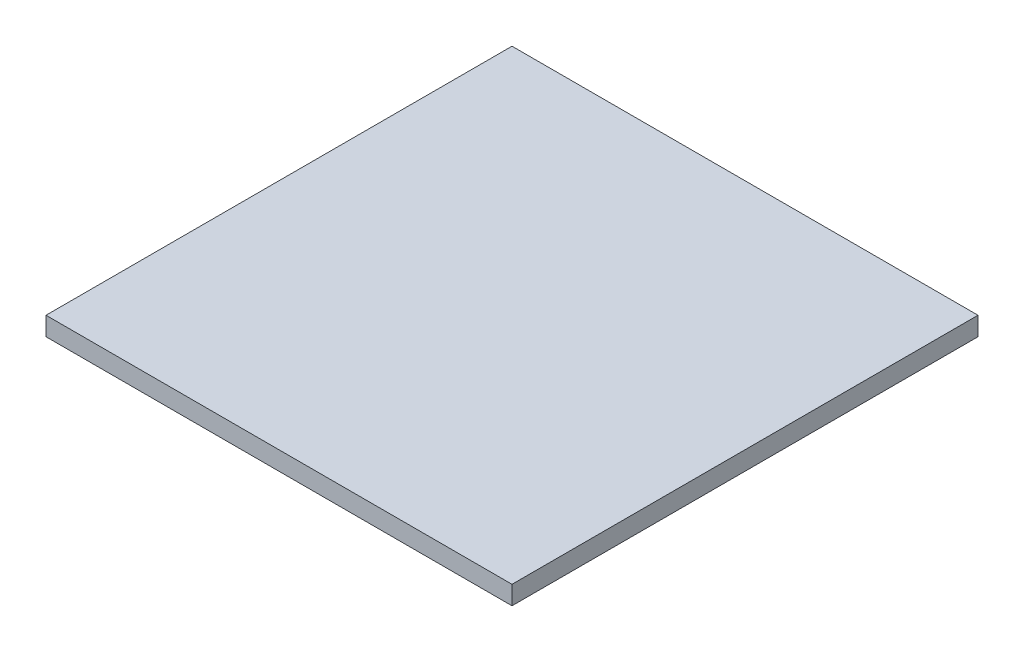
ISO-10303-21;
HEADER;
FILE_DESCRIPTION(('STEP AP214'),'2;1');
FILE_NAME('part.step','',(''),(''),'','','');
FILE_SCHEMA(('AUTOMOTIVE_DESIGN { 1 0 10303 214 1 1 1 1 }'));
ENDSEC;
DATA;
#1=APPLICATION_CONTEXT('core data for automotive mechanical design processes');
#2=APPLICATION_PROTOCOL_DEFINITION('international standard','automotive_design',2000,#1);
#3=PRODUCT_CONTEXT('',#1,'mechanical');
#4=PRODUCT('Part','Part','',(#3));
#5=PRODUCT_RELATED_PRODUCT_CATEGORY('part','',(#4));
#6=PRODUCT_DEFINITION_FORMATION('','',#4);
#7=PRODUCT_DEFINITION_CONTEXT('part definition',#1,'design');
#8=PRODUCT_DEFINITION('design','',#6,#7);
#9=PRODUCT_DEFINITION_SHAPE('','',#8);
#10=(LENGTH_UNIT() NAMED_UNIT(*) SI_UNIT(.MILLI.,.METRE.));
#11=(NAMED_UNIT(*) PLANE_ANGLE_UNIT() SI_UNIT($,.RADIAN.));
#12=(NAMED_UNIT(*) SI_UNIT($,.STERADIAN.) SOLID_ANGLE_UNIT());
#13=UNCERTAINTY_MEASURE_WITH_UNIT(LENGTH_MEASURE(1.E-05),#10,'distance_accuracy_value','');
#14=(GEOMETRIC_REPRESENTATION_CONTEXT(3) GLOBAL_UNCERTAINTY_ASSIGNED_CONTEXT((#13)) GLOBAL_UNIT_ASSIGNED_CONTEXT((#10,
#11,#12)) REPRESENTATION_CONTEXT('',''));
#15=CARTESIAN_POINT('',(0.,0.,0.));
#16=DIRECTION('',(0.,0.,1.));
#17=DIRECTION('',(1.,0.,0.));
#18=AXIS2_PLACEMENT_3D('',#15,#16,#17);
#19=CARTESIAN_POINT('',(-250.,20.,-250.));
#20=DIRECTION('',(1.,0.,0.));
#21=DIRECTION('',(0.,0.,-1.));
#22=AXIS2_PLACEMENT_3D('',#19,#20,#21);
#23=PLANE('',#22);
#24=DIRECTION('',(0.,0.,1.));
#25=VECTOR('',#24,1.);
#26=CARTESIAN_POINT('',(-250.,0.,-250.));
#27=LINE('',#26,#25);
#28=CARTESIAN_POINT('',(-250.,0.,-250.));
#29=VERTEX_POINT('',#28);
#30=CARTESIAN_POINT('',(-250.,0.,250.));
#31=VERTEX_POINT('',#30);
#32=EDGE_CURVE('E96',#29,#31,#27,.T.);
#33=ORIENTED_EDGE('',*,*,#32,.T.);
#34=DIRECTION('',(0.,-1.,0.));
#35=VECTOR('',#34,1.);
#36=CARTESIAN_POINT('',(-250.,20.,250.));
#37=LINE('',#36,#35);
#38=CARTESIAN_POINT('',(-250.,20.,250.));
#39=VERTEX_POINT('',#38);
#40=EDGE_CURVE('E11',#39,#31,#37,.T.);
#41=ORIENTED_EDGE('',*,*,#40,.F.);
#42=DIRECTION('',(0.,0.,1.));
#43=VECTOR('',#42,1.);
#44=CARTESIAN_POINT('',(-250.,20.,-250.));
#45=LINE('',#44,#43);
#46=CARTESIAN_POINT('',(-250.,20.,-250.));
#47=VERTEX_POINT('',#46);
#48=EDGE_CURVE('E84',#47,#39,#45,.T.);
#49=ORIENTED_EDGE('',*,*,#48,.F.);
#50=DIRECTION('',(0.,-1.,0.));
#51=VECTOR('',#50,1.);
#52=CARTESIAN_POINT('',(-250.,20.,-250.));
#53=LINE('',#52,#51);
#54=EDGE_CURVE('E92',#47,#29,#53,.T.);
#55=ORIENTED_EDGE('',*,*,#54,.T.);
#56=EDGE_LOOP('',(#33,#41,#49,#55));
#57=FACE_BOUND('',#56,.T.);
#58=ADVANCED_FACE('F33',(#57),#23,.F.);
#59=CARTESIAN_POINT('',(-250.,20.,250.));
#60=DIRECTION('',(0.,0.,-1.));
#61=DIRECTION('',(-1.,0.,0.));
#62=AXIS2_PLACEMENT_3D('',#59,#60,#61);
#63=PLANE('',#62);
#64=DIRECTION('',(1.,0.,0.));
#65=VECTOR('',#64,1.);
#66=CARTESIAN_POINT('',(-250.,0.,250.));
#67=LINE('',#66,#65);
#68=CARTESIAN_POINT('',(250.,0.,250.));
#69=VERTEX_POINT('',#68);
#70=EDGE_CURVE('E88',#31,#69,#67,.T.);
#71=ORIENTED_EDGE('',*,*,#70,.T.);
#72=DIRECTION('',(0.,-1.,0.));
#73=VECTOR('',#72,1.);
#74=CARTESIAN_POINT('',(250.,20.,250.));
#75=LINE('',#74,#73);
#76=CARTESIAN_POINT('',(250.,20.,250.));
#77=VERTEX_POINT('',#76);
#78=EDGE_CURVE('E41',#77,#69,#75,.T.);
#79=ORIENTED_EDGE('',*,*,#78,.F.);
#80=DIRECTION('',(1.,0.,0.));
#81=VECTOR('',#80,1.);
#82=CARTESIAN_POINT('',(-250.,20.,250.));
#83=LINE('',#82,#81);
#84=EDGE_CURVE('E79',#39,#77,#83,.T.);
#85=ORIENTED_EDGE('',*,*,#84,.F.);
#86=ORIENTED_EDGE('',*,*,#40,.T.);
#87=EDGE_LOOP('',(#71,#79,#85,#86));
#88=FACE_BOUND('',#87,.T.);
#89=ADVANCED_FACE('F87',(#88),#63,.F.);
#90=CARTESIAN_POINT('',(250.,20.,-250.));
#91=DIRECTION('',(-1.,0.,0.));
#92=DIRECTION('',(0.,0.,1.));
#93=AXIS2_PLACEMENT_3D('',#90,#91,#92);
#94=PLANE('',#93);
#95=DIRECTION('',(0.,0.,-1.));
#96=VECTOR('',#95,1.);
#97=CARTESIAN_POINT('',(250.,0.,-250.));
#98=LINE('',#97,#96);
#99=CARTESIAN_POINT('',(250.,0.,-250.));
#100=VERTEX_POINT('',#99);
#101=EDGE_CURVE('E66',#69,#100,#98,.T.);
#102=ORIENTED_EDGE('',*,*,#101,.T.);
#103=DIRECTION('',(0.,-1.,0.));
#104=VECTOR('',#103,1.);
#105=CARTESIAN_POINT('',(250.,20.,-250.));
#106=LINE('',#105,#104);
#107=CARTESIAN_POINT('',(250.,20.,-250.));
#108=VERTEX_POINT('',#107);
#109=EDGE_CURVE('E89',#108,#100,#106,.T.);
#110=ORIENTED_EDGE('',*,*,#109,.F.);
#111=DIRECTION('',(0.,0.,-1.));
#112=VECTOR('',#111,1.);
#113=CARTESIAN_POINT('',(250.,20.,-250.));
#114=LINE('',#113,#112);
#115=EDGE_CURVE('E82',#77,#108,#114,.T.);
#116=ORIENTED_EDGE('',*,*,#115,.F.);
#117=ORIENTED_EDGE('',*,*,#78,.T.);
#118=EDGE_LOOP('',(#102,#110,#116,#117));
#119=FACE_BOUND('',#118,.T.);
#120=ADVANCED_FACE('F90',(#119),#94,.F.);
#121=CARTESIAN_POINT('',(-250.,20.,-250.));
#122=DIRECTION('',(0.,0.,1.));
#123=DIRECTION('',(1.,0.,0.));
#124=AXIS2_PLACEMENT_3D('',#121,#122,#123);
#125=PLANE('',#124);
#126=DIRECTION('',(-1.,0.,0.));
#127=VECTOR('',#126,1.);
#128=CARTESIAN_POINT('',(-250.,0.,-250.));
#129=LINE('',#128,#127);
#130=EDGE_CURVE('E72',#100,#29,#129,.T.);
#131=ORIENTED_EDGE('',*,*,#130,.T.);
#132=ORIENTED_EDGE('',*,*,#54,.F.);
#133=DIRECTION('',(-1.,0.,0.));
#134=VECTOR('',#133,1.);
#135=CARTESIAN_POINT('',(-250.,20.,-250.));
#136=LINE('',#135,#134);
#137=EDGE_CURVE('E49',#108,#47,#136,.T.);
#138=ORIENTED_EDGE('',*,*,#137,.F.);
#139=ORIENTED_EDGE('',*,*,#109,.T.);
#140=EDGE_LOOP('',(#131,#132,#138,#139));
#141=FACE_BOUND('',#140,.T.);
#142=ADVANCED_FACE('F103',(#141),#125,.F.);
#143=CARTESIAN_POINT('',(0.,20.,0.));
#144=DIRECTION('',(0.,1.,0.));
#145=DIRECTION('',(0.,0.,1.));
#146=AXIS2_PLACEMENT_3D('',#143,#144,#145);
#147=PLANE('',#146);
#148=ORIENTED_EDGE('',*,*,#48,.T.);
#149=ORIENTED_EDGE('',*,*,#84,.T.);
#150=ORIENTED_EDGE('',*,*,#115,.T.);
#151=ORIENTED_EDGE('',*,*,#137,.T.);
#152=EDGE_LOOP('',(#148,#149,#150,#151));
#153=FACE_BOUND('',#152,.T.);
#154=ADVANCED_FACE('F80',(#153),#147,.T.);
#155=CARTESIAN_POINT('',(0.,0.,0.));
#156=DIRECTION('',(0.,1.,0.));
#157=DIRECTION('',(0.,0.,1.));
#158=AXIS2_PLACEMENT_3D('',#155,#156,#157);
#159=PLANE('',#158);
#160=ORIENTED_EDGE('',*,*,#32,.F.);
#161=ORIENTED_EDGE('',*,*,#130,.F.);
#162=ORIENTED_EDGE('',*,*,#101,.F.);
#163=ORIENTED_EDGE('',*,*,#70,.F.);
#164=EDGE_LOOP('',(#160,#161,#162,#163));
#165=FACE_BOUND('',#164,.T.);
#166=ADVANCED_FACE('F106',(#165),#159,.F.);
#167=CLOSED_SHELL('',(#58,#89,#120,#142,#154,#166));
#168=MANIFOLD_SOLID_BREP('B2',#167);
#169=ADVANCED_BREP_SHAPE_REPRESENTATION('',(#18,#168),#14);
#170=SHAPE_DEFINITION_REPRESENTATION(#9,#169);
ENDSEC;
END-ISO-10303-21;
